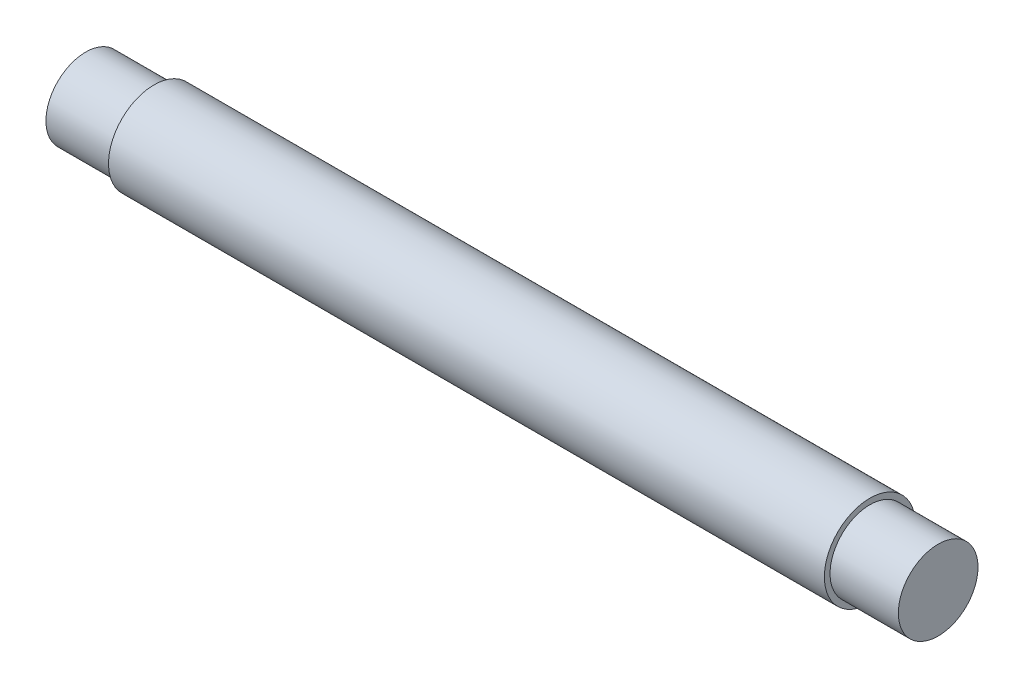
ISO-10303-21;
HEADER;
FILE_DESCRIPTION(('STEP AP214'),'2;1');
FILE_NAME('part.step','',(''),(''),'','','');
FILE_SCHEMA(('AUTOMOTIVE_DESIGN { 1 0 10303 214 1 1 1 1 }'));
ENDSEC;
DATA;
#1=APPLICATION_CONTEXT('core data for automotive mechanical design processes');
#2=APPLICATION_PROTOCOL_DEFINITION('international standard','automotive_design',2000,#1);
#3=PRODUCT_CONTEXT('',#1,'mechanical');
#4=PRODUCT('Part','Part','',(#3));
#5=PRODUCT_RELATED_PRODUCT_CATEGORY('part','',(#4));
#6=PRODUCT_DEFINITION_FORMATION('','',#4);
#7=PRODUCT_DEFINITION_CONTEXT('part definition',#1,'design');
#8=PRODUCT_DEFINITION('design','',#6,#7);
#9=PRODUCT_DEFINITION_SHAPE('','',#8);
#10=(LENGTH_UNIT() NAMED_UNIT(*) SI_UNIT(.MILLI.,.METRE.));
#11=(NAMED_UNIT(*) PLANE_ANGLE_UNIT() SI_UNIT($,.RADIAN.));
#12=(NAMED_UNIT(*) SI_UNIT($,.STERADIAN.) SOLID_ANGLE_UNIT());
#13=UNCERTAINTY_MEASURE_WITH_UNIT(LENGTH_MEASURE(1.E-05),#10,'distance_accuracy_value','');
#14=(GEOMETRIC_REPRESENTATION_CONTEXT(3) GLOBAL_UNCERTAINTY_ASSIGNED_CONTEXT((#13)) GLOBAL_UNIT_ASSIGNED_CONTEXT((#10,
#11,#12)) REPRESENTATION_CONTEXT('',''));
#15=CARTESIAN_POINT('',(0.,0.,0.));
#16=DIRECTION('',(0.,0.,1.));
#17=DIRECTION('',(1.,0.,0.));
#18=AXIS2_PLACEMENT_3D('',#15,#16,#17);
#19=CARTESIAN_POINT('',(-187.25,0.,0.));
#20=DIRECTION('',(-1.,0.,0.));
#21=DIRECTION('',(0.,0.,1.));
#22=AXIS2_PLACEMENT_3D('',#19,#20,#21);
#23=PLANE('',#22);
#24=CARTESIAN_POINT('',(-187.25,0.,0.));
#25=DIRECTION('',(1.,0.,0.));
#26=DIRECTION('',(0.,0.,-1.));
#27=AXIS2_PLACEMENT_3D('',#24,#25,#26);
#28=CIRCLE('',#27,17.5);
#29=CARTESIAN_POINT('',(-187.25,0.,-17.5));
#30=VERTEX_POINT('',#29);
#31=EDGE_CURVE('E10',#30,#30,#28,.T.);
#32=ORIENTED_EDGE('',*,*,#31,.F.);
#33=EDGE_LOOP('',(#32));
#34=FACE_BOUND('',#33,.T.);
#35=ADVANCED_FACE('F37',(#34),#23,.T.);
#36=CARTESIAN_POINT('',(187.25,0.,0.));
#37=DIRECTION('',(1.,0.,0.));
#38=DIRECTION('',(0.,0.,-1.));
#39=AXIS2_PLACEMENT_3D('',#36,#37,#38);
#40=CYLINDRICAL_SURFACE('',#39,17.5);
#41=ORIENTED_EDGE('',*,*,#31,.T.);
#42=EDGE_LOOP('',(#41));
#43=FACE_BOUND('',#42,.T.);
#44=CARTESIAN_POINT('',(-157.25,0.,0.));
#45=DIRECTION('',(1.,0.,0.));
#46=DIRECTION('',(0.,0.,-1.));
#47=AXIS2_PLACEMENT_3D('',#44,#45,#46);
#48=CIRCLE('',#47,17.5);
#49=CARTESIAN_POINT('',(-157.25,0.,-17.5));
#50=VERTEX_POINT('',#49);
#51=EDGE_CURVE('E43',#50,#50,#48,.T.);
#52=ORIENTED_EDGE('',*,*,#51,.F.);
#53=EDGE_LOOP('',(#52));
#54=FACE_BOUND('',#53,.T.);
#55=ADVANCED_FACE('F79',(#43,#54),#40,.T.);
#56=CARTESIAN_POINT('',(-157.25,0.,-17.5));
#57=DIRECTION('',(-1.,0.,0.));
#58=DIRECTION('',(0.,0.,1.));
#59=AXIS2_PLACEMENT_3D('',#56,#57,#58);
#60=PLANE('',#59);
#61=ORIENTED_EDGE('',*,*,#51,.T.);
#62=EDGE_LOOP('',(#61));
#63=FACE_BOUND('',#62,.T.);
#64=CARTESIAN_POINT('',(-157.25,0.,0.));
#65=DIRECTION('',(1.,0.,0.));
#66=DIRECTION('',(0.,0.,-1.));
#67=AXIS2_PLACEMENT_3D('',#64,#65,#66);
#68=CIRCLE('',#67,20.);
#69=CARTESIAN_POINT('',(-157.25,0.,-20.));
#70=VERTEX_POINT('',#69);
#71=EDGE_CURVE('E47',#70,#70,#68,.T.);
#72=ORIENTED_EDGE('',*,*,#71,.F.);
#73=EDGE_LOOP('',(#72));
#74=FACE_BOUND('',#73,.T.);
#75=ADVANCED_FACE('F84',(#63,#74),#60,.T.);
#76=CARTESIAN_POINT('',(187.25,0.,0.));
#77=DIRECTION('',(1.,0.,0.));
#78=DIRECTION('',(0.,0.,-1.));
#79=AXIS2_PLACEMENT_3D('',#76,#77,#78);
#80=CYLINDRICAL_SURFACE('',#79,20.);
#81=ORIENTED_EDGE('',*,*,#71,.T.);
#82=EDGE_LOOP('',(#81));
#83=FACE_BOUND('',#82,.T.);
#84=CARTESIAN_POINT('',(157.25,0.,0.));
#85=DIRECTION('',(1.,0.,0.));
#86=DIRECTION('',(0.,0.,-1.));
#87=AXIS2_PLACEMENT_3D('',#84,#85,#86);
#88=CIRCLE('',#87,20.);
#89=CARTESIAN_POINT('',(157.25,0.,-20.));
#90=VERTEX_POINT('',#89);
#91=EDGE_CURVE('E51',#90,#90,#88,.T.);
#92=ORIENTED_EDGE('',*,*,#91,.F.);
#93=EDGE_LOOP('',(#92));
#94=FACE_BOUND('',#93,.T.);
#95=ADVANCED_FACE('F75',(#83,#94),#80,.T.);
#96=CARTESIAN_POINT('',(157.25,0.,-20.));
#97=DIRECTION('',(1.,0.,0.));
#98=DIRECTION('',(0.,0.,-1.));
#99=AXIS2_PLACEMENT_3D('',#96,#97,#98);
#100=PLANE('',#99);
#101=ORIENTED_EDGE('',*,*,#91,.T.);
#102=EDGE_LOOP('',(#101));
#103=FACE_BOUND('',#102,.T.);
#104=CARTESIAN_POINT('',(157.25,0.,0.));
#105=DIRECTION('',(1.,0.,0.));
#106=DIRECTION('',(0.,0.,-1.));
#107=AXIS2_PLACEMENT_3D('',#104,#105,#106);
#108=CIRCLE('',#107,17.5);
#109=CARTESIAN_POINT('',(157.25,0.,-17.5));
#110=VERTEX_POINT('',#109);
#111=EDGE_CURVE('E56',#110,#110,#108,.T.);
#112=ORIENTED_EDGE('',*,*,#111,.F.);
#113=EDGE_LOOP('',(#112));
#114=FACE_BOUND('',#113,.T.);
#115=ADVANCED_FACE('F67',(#103,#114),#100,.T.);
#116=CARTESIAN_POINT('',(187.25,0.,0.));
#117=DIRECTION('',(1.,0.,0.));
#118=DIRECTION('',(0.,0.,-1.));
#119=AXIS2_PLACEMENT_3D('',#116,#117,#118);
#120=CYLINDRICAL_SURFACE('',#119,17.5);
#121=ORIENTED_EDGE('',*,*,#111,.T.);
#122=EDGE_LOOP('',(#121));
#123=FACE_BOUND('',#122,.T.);
#124=CARTESIAN_POINT('',(187.25,0.,0.));
#125=DIRECTION('',(1.,0.,0.));
#126=DIRECTION('',(0.,0.,-1.));
#127=AXIS2_PLACEMENT_3D('',#124,#125,#126);
#128=CIRCLE('',#127,17.5);
#129=CARTESIAN_POINT('',(187.25,0.,-17.5));
#130=VERTEX_POINT('',#129);
#131=EDGE_CURVE('E59',#130,#130,#128,.T.);
#132=ORIENTED_EDGE('',*,*,#131,.F.);
#133=EDGE_LOOP('',(#132));
#134=FACE_BOUND('',#133,.T.);
#135=ADVANCED_FACE('F65',(#123,#134),#120,.T.);
#136=CARTESIAN_POINT('',(187.25,0.,-17.5));
#137=DIRECTION('',(1.,0.,0.));
#138=DIRECTION('',(0.,0.,-1.));
#139=AXIS2_PLACEMENT_3D('',#136,#137,#138);
#140=PLANE('',#139);
#141=ORIENTED_EDGE('',*,*,#131,.T.);
#142=EDGE_LOOP('',(#141));
#143=FACE_BOUND('',#142,.T.);
#144=ADVANCED_FACE('F63',(#143),#140,.T.);
#145=CLOSED_SHELL('',(#35,#55,#75,#95,#115,#135,#144));
#146=MANIFOLD_SOLID_BREP('B2',#145);
#147=ADVANCED_BREP_SHAPE_REPRESENTATION('',(#18,#146),#14);
#148=SHAPE_DEFINITION_REPRESENTATION(#9,#147);
ENDSEC;
END-ISO-10303-21;
